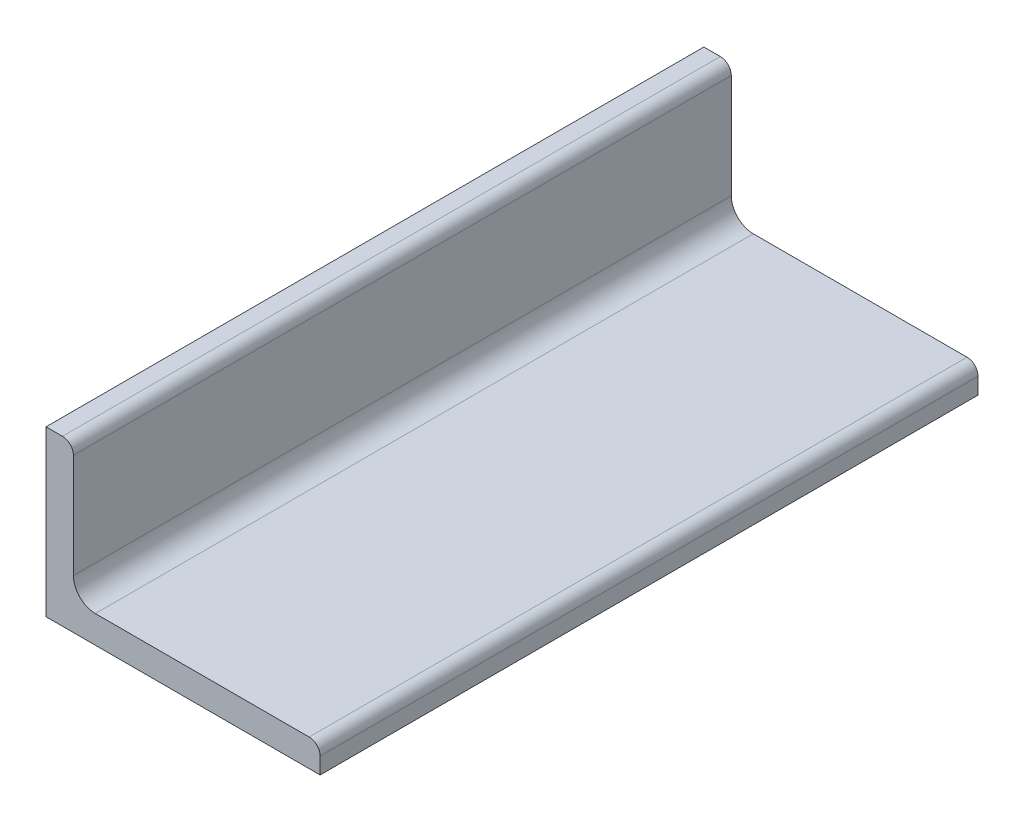
ISO-10303-21;
HEADER;
FILE_DESCRIPTION(('STEP AP214'),'2;1');
FILE_NAME('part.step','',(''),(''),'','','');
FILE_SCHEMA(('AUTOMOTIVE_DESIGN { 1 0 10303 214 1 1 1 1 }'));
ENDSEC;
DATA;
#1=APPLICATION_CONTEXT('core data for automotive mechanical design processes');
#2=APPLICATION_PROTOCOL_DEFINITION('international standard','automotive_design',2000,#1);
#3=PRODUCT_CONTEXT('',#1,'mechanical');
#4=PRODUCT('Part','Part','',(#3));
#5=PRODUCT_RELATED_PRODUCT_CATEGORY('part','',(#4));
#6=PRODUCT_DEFINITION_FORMATION('','',#4);
#7=PRODUCT_DEFINITION_CONTEXT('part definition',#1,'design');
#8=PRODUCT_DEFINITION('design','',#6,#7);
#9=PRODUCT_DEFINITION_SHAPE('','',#8);
#10=(LENGTH_UNIT() NAMED_UNIT(*) SI_UNIT(.MILLI.,.METRE.));
#11=(NAMED_UNIT(*) PLANE_ANGLE_UNIT() SI_UNIT($,.RADIAN.));
#12=(NAMED_UNIT(*) SI_UNIT($,.STERADIAN.) SOLID_ANGLE_UNIT());
#13=UNCERTAINTY_MEASURE_WITH_UNIT(LENGTH_MEASURE(1.E-05),#10,'distance_accuracy_value','');
#14=(GEOMETRIC_REPRESENTATION_CONTEXT(3) GLOBAL_UNCERTAINTY_ASSIGNED_CONTEXT((#13)) GLOBAL_UNIT_ASSIGNED_CONTEXT((#10,
#11,#12)) REPRESENTATION_CONTEXT('',''));
#15=CARTESIAN_POINT('',(0.,0.,0.));
#16=DIRECTION('',(0.,0.,1.));
#17=DIRECTION('',(1.,0.,0.));
#18=AXIS2_PLACEMENT_3D('',#15,#16,#17);
#19=CARTESIAN_POINT('',(150.,0.,180.));
#20=DIRECTION('',(0.,1.,0.));
#21=DIRECTION('',(-1.,0.,0.));
#22=AXIS2_PLACEMENT_3D('',#19,#20,#21);
#23=PLANE('',#22);
#24=DIRECTION('',(1.,0.,0.));
#25=VECTOR('',#24,1.);
#26=CARTESIAN_POINT('',(150.,0.,-180.));
#27=LINE('',#26,#25);
#28=CARTESIAN_POINT('',(0.,0.,-180.));
#29=VERTEX_POINT('',#28);
#30=CARTESIAN_POINT('',(150.,0.,-180.));
#31=VERTEX_POINT('',#30);
#32=EDGE_CURVE('E172',#29,#31,#27,.T.);
#33=ORIENTED_EDGE('',*,*,#32,.T.);
#34=DIRECTION('',(0.,0.,-1.));
#35=VECTOR('',#34,1.);
#36=CARTESIAN_POINT('',(150.,0.,180.));
#37=LINE('',#36,#35);
#38=CARTESIAN_POINT('',(150.,0.,180.));
#39=VERTEX_POINT('',#38);
#40=EDGE_CURVE('E13',#39,#31,#37,.T.);
#41=ORIENTED_EDGE('',*,*,#40,.F.);
#42=DIRECTION('',(1.,0.,0.));
#43=VECTOR('',#42,1.);
#44=CARTESIAN_POINT('',(150.,0.,180.));
#45=LINE('',#44,#43);
#46=CARTESIAN_POINT('',(0.,0.,180.));
#47=VERTEX_POINT('',#46);
#48=EDGE_CURVE('E188',#47,#39,#45,.T.);
#49=ORIENTED_EDGE('',*,*,#48,.F.);
#50=DIRECTION('',(0.,0.,-1.));
#51=VECTOR('',#50,1.);
#52=CARTESIAN_POINT('',(0.,0.,180.));
#53=LINE('',#52,#51);
#54=EDGE_CURVE('E168',#47,#29,#53,.T.);
#55=ORIENTED_EDGE('',*,*,#54,.T.);
#56=EDGE_LOOP('',(#33,#41,#49,#55));
#57=FACE_BOUND('',#56,.T.);
#58=ADVANCED_FACE('F70',(#57),#23,.F.);
#59=CARTESIAN_POINT('',(150.,8.99999999999998,180.));
#60=DIRECTION('',(-1.,0.,0.));
#61=DIRECTION('',(0.,0.,1.));
#62=AXIS2_PLACEMENT_3D('',#59,#60,#61);
#63=PLANE('',#62);
#64=DIRECTION('',(0.,1.,0.));
#65=VECTOR('',#64,1.);
#66=CARTESIAN_POINT('',(150.,8.99999999999998,-180.));
#67=LINE('',#66,#65);
#68=CARTESIAN_POINT('',(150.,8.99999999999998,-180.));
#69=VERTEX_POINT('',#68);
#70=EDGE_CURVE('E175',#31,#69,#67,.T.);
#71=ORIENTED_EDGE('',*,*,#70,.T.);
#72=DIRECTION('',(0.,0.,-1.));
#73=VECTOR('',#72,1.);
#74=CARTESIAN_POINT('',(150.,8.99999999999998,180.));
#75=LINE('',#74,#73);
#76=CARTESIAN_POINT('',(150.,8.99999999999998,180.));
#77=VERTEX_POINT('',#76);
#78=EDGE_CURVE('E78',#77,#69,#75,.T.);
#79=ORIENTED_EDGE('',*,*,#78,.F.);
#80=DIRECTION('',(0.,1.,0.));
#81=VECTOR('',#80,1.);
#82=CARTESIAN_POINT('',(150.,8.99999999999998,180.));
#83=LINE('',#82,#81);
#84=EDGE_CURVE('E132',#39,#77,#83,.T.);
#85=ORIENTED_EDGE('',*,*,#84,.F.);
#86=ORIENTED_EDGE('',*,*,#40,.T.);
#87=EDGE_LOOP('',(#71,#79,#85,#86));
#88=FACE_BOUND('',#87,.T.);
#89=ADVANCED_FACE('F231',(#88),#63,.F.);
#90=CARTESIAN_POINT('',(144.,8.99999999999998,180.));
#91=DIRECTION('',(0.,0.,-1.));
#92=DIRECTION('',(-1.,0.,0.));
#93=AXIS2_PLACEMENT_3D('',#90,#91,#92);
#94=CYLINDRICAL_SURFACE('',#93,6.);
#95=CARTESIAN_POINT('',(144.,8.99999999999998,-180.));
#96=DIRECTION('',(0.,0.,1.));
#97=DIRECTION('',(1.,0.,0.));
#98=AXIS2_PLACEMENT_3D('',#95,#96,#97);
#99=CIRCLE('',#98,6.);
#100=CARTESIAN_POINT('',(144.,15.,-180.));
#101=VERTEX_POINT('',#100);
#102=EDGE_CURVE('E177',#69,#101,#99,.T.);
#103=ORIENTED_EDGE('',*,*,#102,.T.);
#104=DIRECTION('',(0.,0.,-1.));
#105=VECTOR('',#104,1.);
#106=CARTESIAN_POINT('',(144.,15.,180.));
#107=LINE('',#106,#105);
#108=CARTESIAN_POINT('',(144.,15.,180.));
#109=VERTEX_POINT('',#108);
#110=EDGE_CURVE('E198',#109,#101,#107,.T.);
#111=ORIENTED_EDGE('',*,*,#110,.F.);
#112=CARTESIAN_POINT('',(144.,8.99999999999998,180.));
#113=DIRECTION('',(0.,0.,1.));
#114=DIRECTION('',(1.,0.,0.));
#115=AXIS2_PLACEMENT_3D('',#112,#113,#114);
#116=CIRCLE('',#115,6.);
#117=EDGE_CURVE('E206',#77,#109,#116,.T.);
#118=ORIENTED_EDGE('',*,*,#117,.F.);
#119=ORIENTED_EDGE('',*,*,#78,.T.);
#120=EDGE_LOOP('',(#103,#111,#118,#119));
#121=FACE_BOUND('',#120,.T.);
#122=ADVANCED_FACE('F204',(#121),#94,.T.);
#123=CARTESIAN_POINT('',(27.,15.,180.));
#124=DIRECTION('',(0.,-1.,0.));
#125=DIRECTION('',(1.,0.,0.));
#126=AXIS2_PLACEMENT_3D('',#123,#124,#125);
#127=PLANE('',#126);
#128=DIRECTION('',(-1.,0.,0.));
#129=VECTOR('',#128,1.);
#130=CARTESIAN_POINT('',(27.,15.,-180.));
#131=LINE('',#130,#129);
#132=CARTESIAN_POINT('',(27.,15.,-180.));
#133=VERTEX_POINT('',#132);
#134=EDGE_CURVE('E179',#101,#133,#131,.T.);
#135=ORIENTED_EDGE('',*,*,#134,.T.);
#136=DIRECTION('',(0.,0.,-1.));
#137=VECTOR('',#136,1.);
#138=CARTESIAN_POINT('',(27.,15.,180.));
#139=LINE('',#138,#137);
#140=CARTESIAN_POINT('',(27.,15.,180.));
#141=VERTEX_POINT('',#140);
#142=EDGE_CURVE('E195',#141,#133,#139,.T.);
#143=ORIENTED_EDGE('',*,*,#142,.F.);
#144=DIRECTION('',(-1.,0.,0.));
#145=VECTOR('',#144,1.);
#146=CARTESIAN_POINT('',(27.,15.,180.));
#147=LINE('',#146,#145);
#148=EDGE_CURVE('E222',#109,#141,#147,.T.);
#149=ORIENTED_EDGE('',*,*,#148,.F.);
#150=ORIENTED_EDGE('',*,*,#110,.T.);
#151=EDGE_LOOP('',(#135,#143,#149,#150));
#152=FACE_BOUND('',#151,.T.);
#153=ADVANCED_FACE('F215',(#152),#127,.F.);
#154=CARTESIAN_POINT('',(27.,27.,180.));
#155=DIRECTION('',(0.,0.,-1.));
#156=DIRECTION('',(-1.,0.,0.));
#157=AXIS2_PLACEMENT_3D('',#154,#155,#156);
#158=CYLINDRICAL_SURFACE('',#157,12.);
#159=CARTESIAN_POINT('',(27.,27.,-180.));
#160=DIRECTION('',(0.,0.,-1.));
#161=DIRECTION('',(-1.,0.,0.));
#162=AXIS2_PLACEMENT_3D('',#159,#160,#161);
#163=CIRCLE('',#162,12.);
#164=CARTESIAN_POINT('',(15.,27.,-180.));
#165=VERTEX_POINT('',#164);
#166=EDGE_CURVE('E181',#133,#165,#163,.T.);
#167=ORIENTED_EDGE('',*,*,#166,.T.);
#168=DIRECTION('',(0.,0.,-1.));
#169=VECTOR('',#168,1.);
#170=CARTESIAN_POINT('',(15.,27.,180.));
#171=LINE('',#170,#169);
#172=CARTESIAN_POINT('',(15.,27.,180.));
#173=VERTEX_POINT('',#172);
#174=EDGE_CURVE('E192',#173,#165,#171,.T.);
#175=ORIENTED_EDGE('',*,*,#174,.F.);
#176=CARTESIAN_POINT('',(27.,27.,180.));
#177=DIRECTION('',(0.,0.,-1.));
#178=DIRECTION('',(-1.,0.,0.));
#179=AXIS2_PLACEMENT_3D('',#176,#177,#178);
#180=CIRCLE('',#179,12.);
#181=EDGE_CURVE('E221',#141,#173,#180,.T.);
#182=ORIENTED_EDGE('',*,*,#181,.F.);
#183=ORIENTED_EDGE('',*,*,#142,.T.);
#184=EDGE_LOOP('',(#167,#175,#182,#183));
#185=FACE_BOUND('',#184,.T.);
#186=ADVANCED_FACE('F219',(#185),#158,.F.);
#187=CARTESIAN_POINT('',(15.,84.,180.));
#188=DIRECTION('',(-1.,0.,0.));
#189=DIRECTION('',(0.,-1.,0.));
#190=AXIS2_PLACEMENT_3D('',#187,#188,#189);
#191=PLANE('',#190);
#192=DIRECTION('',(0.,1.,0.));
#193=VECTOR('',#192,1.);
#194=CARTESIAN_POINT('',(15.,84.,-180.));
#195=LINE('',#194,#193);
#196=CARTESIAN_POINT('',(15.,84.,-180.));
#197=VERTEX_POINT('',#196);
#198=EDGE_CURVE('E183',#165,#197,#195,.T.);
#199=ORIENTED_EDGE('',*,*,#198,.T.);
#200=DIRECTION('',(0.,0.,-1.));
#201=VECTOR('',#200,1.);
#202=CARTESIAN_POINT('',(15.,84.,180.));
#203=LINE('',#202,#201);
#204=CARTESIAN_POINT('',(15.,84.,180.));
#205=VERTEX_POINT('',#204);
#206=EDGE_CURVE('E163',#205,#197,#203,.T.);
#207=ORIENTED_EDGE('',*,*,#206,.F.);
#208=DIRECTION('',(0.,1.,0.));
#209=VECTOR('',#208,1.);
#210=CARTESIAN_POINT('',(15.,84.,180.));
#211=LINE('',#210,#209);
#212=EDGE_CURVE('E154',#173,#205,#211,.T.);
#213=ORIENTED_EDGE('',*,*,#212,.F.);
#214=ORIENTED_EDGE('',*,*,#174,.T.);
#215=EDGE_LOOP('',(#199,#207,#213,#214));
#216=FACE_BOUND('',#215,.T.);
#217=ADVANCED_FACE('F243',(#216),#191,.F.);
#218=CARTESIAN_POINT('',(8.99999999999998,84.,180.));
#219=DIRECTION('',(0.,0.,-1.));
#220=DIRECTION('',(-1.,0.,0.));
#221=AXIS2_PLACEMENT_3D('',#218,#219,#220);
#222=CYLINDRICAL_SURFACE('',#221,6.00000000000001);
#223=CARTESIAN_POINT('',(8.99999999999998,84.,-180.));
#224=DIRECTION('',(0.,0.,1.));
#225=DIRECTION('',(-1.,0.,0.));
#226=AXIS2_PLACEMENT_3D('',#223,#224,#225);
#227=CIRCLE('',#226,6.00000000000001);
#228=CARTESIAN_POINT('',(8.99999999999998,90.,-180.));
#229=VERTEX_POINT('',#228);
#230=EDGE_CURVE('E162',#197,#229,#227,.T.);
#231=ORIENTED_EDGE('',*,*,#230,.T.);
#232=DIRECTION('',(0.,0.,-1.));
#233=VECTOR('',#232,1.);
#234=CARTESIAN_POINT('',(8.99999999999998,90.,180.));
#235=LINE('',#234,#233);
#236=CARTESIAN_POINT('',(8.99999999999998,90.,180.));
#237=VERTEX_POINT('',#236);
#238=EDGE_CURVE('E159',#237,#229,#235,.T.);
#239=ORIENTED_EDGE('',*,*,#238,.F.);
#240=CARTESIAN_POINT('',(8.99999999999998,84.,180.));
#241=DIRECTION('',(0.,0.,1.));
#242=DIRECTION('',(-1.,0.,0.));
#243=AXIS2_PLACEMENT_3D('',#240,#241,#242);
#244=CIRCLE('',#243,6.00000000000001);
#245=EDGE_CURVE('E148',#205,#237,#244,.T.);
#246=ORIENTED_EDGE('',*,*,#245,.F.);
#247=ORIENTED_EDGE('',*,*,#206,.T.);
#248=EDGE_LOOP('',(#231,#239,#246,#247));
#249=FACE_BOUND('',#248,.T.);
#250=ADVANCED_FACE('F160',(#249),#222,.T.);
#251=CARTESIAN_POINT('',(0.,90.,180.));
#252=DIRECTION('',(0.,-1.,0.));
#253=DIRECTION('',(0.,0.,-1.));
#254=AXIS2_PLACEMENT_3D('',#251,#252,#253);
#255=PLANE('',#254);
#256=DIRECTION('',(-1.,0.,0.));
#257=VECTOR('',#256,1.);
#258=CARTESIAN_POINT('',(0.,90.,-180.));
#259=LINE('',#258,#257);
#260=CARTESIAN_POINT('',(0.,90.,-180.));
#261=VERTEX_POINT('',#260);
#262=EDGE_CURVE('E118',#229,#261,#259,.T.);
#263=ORIENTED_EDGE('',*,*,#262,.T.);
#264=DIRECTION('',(0.,0.,-1.));
#265=VECTOR('',#264,1.);
#266=CARTESIAN_POINT('',(0.,90.,180.));
#267=LINE('',#266,#265);
#268=CARTESIAN_POINT('',(0.,90.,180.));
#269=VERTEX_POINT('',#268);
#270=EDGE_CURVE('E164',#269,#261,#267,.T.);
#271=ORIENTED_EDGE('',*,*,#270,.F.);
#272=DIRECTION('',(-1.,0.,0.));
#273=VECTOR('',#272,1.);
#274=CARTESIAN_POINT('',(0.,90.,180.));
#275=LINE('',#274,#273);
#276=EDGE_CURVE('E152',#237,#269,#275,.T.);
#277=ORIENTED_EDGE('',*,*,#276,.F.);
#278=ORIENTED_EDGE('',*,*,#238,.T.);
#279=EDGE_LOOP('',(#263,#271,#277,#278));
#280=FACE_BOUND('',#279,.T.);
#281=ADVANCED_FACE('F166',(#280),#255,.F.);
#282=CARTESIAN_POINT('',(0.,90.,180.));
#283=DIRECTION('',(1.,0.,0.));
#284=DIRECTION('',(0.,1.,0.));
#285=AXIS2_PLACEMENT_3D('',#282,#283,#284);
#286=PLANE('',#285);
#287=DIRECTION('',(0.,-1.,0.));
#288=VECTOR('',#287,1.);
#289=CARTESIAN_POINT('',(0.,90.,-180.));
#290=LINE('',#289,#288);
#291=EDGE_CURVE('E124',#261,#29,#290,.T.);
#292=ORIENTED_EDGE('',*,*,#291,.T.);
#293=ORIENTED_EDGE('',*,*,#54,.F.);
#294=DIRECTION('',(0.,-1.,0.));
#295=VECTOR('',#294,1.);
#296=CARTESIAN_POINT('',(0.,90.,180.));
#297=LINE('',#296,#295);
#298=EDGE_CURVE('E86',#269,#47,#297,.T.);
#299=ORIENTED_EDGE('',*,*,#298,.F.);
#300=ORIENTED_EDGE('',*,*,#270,.T.);
#301=EDGE_LOOP('',(#292,#293,#299,#300));
#302=FACE_BOUND('',#301,.T.);
#303=ADVANCED_FACE('F251',(#302),#286,.F.);
#304=CARTESIAN_POINT('',(8.99999999999998,84.,180.));
#305=DIRECTION('',(0.,0.,-1.));
#306=DIRECTION('',(-1.,0.,0.));
#307=AXIS2_PLACEMENT_3D('',#304,#305,#306);
#308=PLANE('',#307);
#309=ORIENTED_EDGE('',*,*,#48,.T.);
#310=ORIENTED_EDGE('',*,*,#84,.T.);
#311=ORIENTED_EDGE('',*,*,#117,.T.);
#312=ORIENTED_EDGE('',*,*,#148,.T.);
#313=ORIENTED_EDGE('',*,*,#181,.T.);
#314=ORIENTED_EDGE('',*,*,#212,.T.);
#315=ORIENTED_EDGE('',*,*,#245,.T.);
#316=ORIENTED_EDGE('',*,*,#276,.T.);
#317=ORIENTED_EDGE('',*,*,#298,.T.);
#318=EDGE_LOOP('',(#309,#310,#311,#312,#313,#314,#315,#316,#317));
#319=FACE_BOUND('',#318,.T.);
#320=ADVANCED_FACE('F150',(#319),#308,.F.);
#321=CARTESIAN_POINT('',(8.99999999999998,84.,-180.));
#322=DIRECTION('',(0.,0.,-1.));
#323=DIRECTION('',(-1.,0.,0.));
#324=AXIS2_PLACEMENT_3D('',#321,#322,#323);
#325=PLANE('',#324);
#326=ORIENTED_EDGE('',*,*,#32,.F.);
#327=ORIENTED_EDGE('',*,*,#291,.F.);
#328=ORIENTED_EDGE('',*,*,#262,.F.);
#329=ORIENTED_EDGE('',*,*,#230,.F.);
#330=ORIENTED_EDGE('',*,*,#198,.F.);
#331=ORIENTED_EDGE('',*,*,#166,.F.);
#332=ORIENTED_EDGE('',*,*,#134,.F.);
#333=ORIENTED_EDGE('',*,*,#102,.F.);
#334=ORIENTED_EDGE('',*,*,#70,.F.);
#335=EDGE_LOOP('',(#326,#327,#328,#329,#330,#331,#332,#333,#334));
#336=FACE_BOUND('',#335,.T.);
#337=ADVANCED_FACE('F210',(#336),#325,.T.);
#338=CLOSED_SHELL('',(#58,#89,#122,#153,#186,#217,#250,#281,#303,#320,#337));
#339=MANIFOLD_SOLID_BREP('B2',#338);
#340=ADVANCED_BREP_SHAPE_REPRESENTATION('',(#18,#339),#14);
#341=SHAPE_DEFINITION_REPRESENTATION(#9,#340);
ENDSEC;
END-ISO-10303-21;
